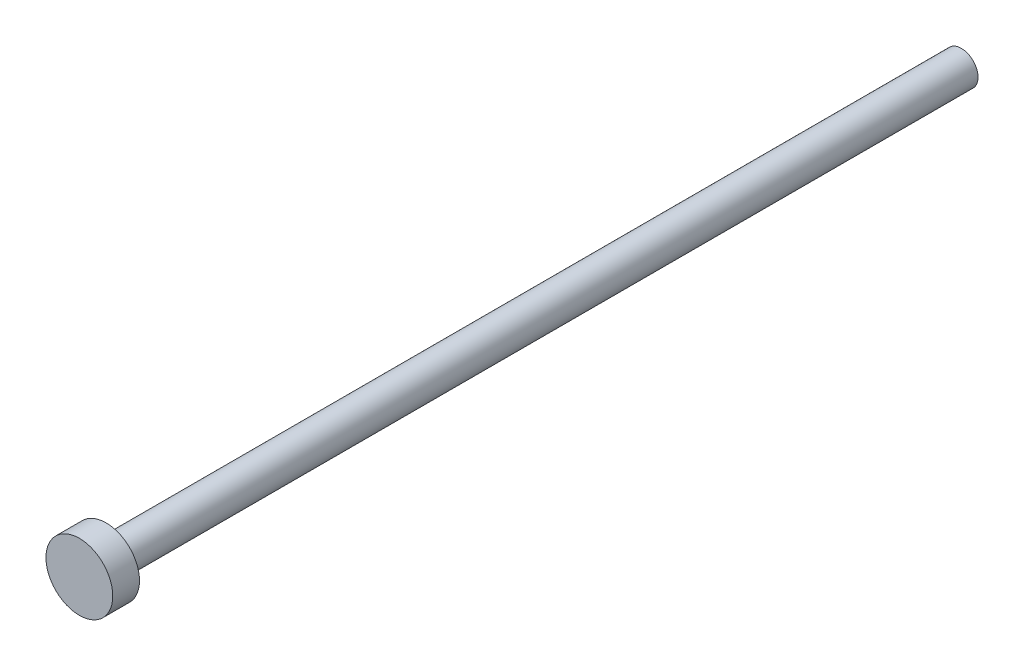
ISO-10303-21;
HEADER;
FILE_DESCRIPTION(('STEP AP214'),'2;1');
FILE_NAME('part.step','',(''),(''),'','','');
FILE_SCHEMA(('AUTOMOTIVE_DESIGN { 1 0 10303 214 1 1 1 1 }'));
ENDSEC;
DATA;
#1=APPLICATION_CONTEXT('core data for automotive mechanical design processes');
#2=APPLICATION_PROTOCOL_DEFINITION('international standard','automotive_design',2000,#1);
#3=PRODUCT_CONTEXT('',#1,'mechanical');
#4=PRODUCT('Part','Part','',(#3));
#5=PRODUCT_RELATED_PRODUCT_CATEGORY('part','',(#4));
#6=PRODUCT_DEFINITION_FORMATION('','',#4);
#7=PRODUCT_DEFINITION_CONTEXT('part definition',#1,'design');
#8=PRODUCT_DEFINITION('design','',#6,#7);
#9=PRODUCT_DEFINITION_SHAPE('','',#8);
#10=(LENGTH_UNIT() NAMED_UNIT(*) SI_UNIT(.MILLI.,.METRE.));
#11=(NAMED_UNIT(*) PLANE_ANGLE_UNIT() SI_UNIT($,.RADIAN.));
#12=(NAMED_UNIT(*) SI_UNIT($,.STERADIAN.) SOLID_ANGLE_UNIT());
#13=UNCERTAINTY_MEASURE_WITH_UNIT(LENGTH_MEASURE(1.E-05),#10,'distance_accuracy_value','');
#14=(GEOMETRIC_REPRESENTATION_CONTEXT(3) GLOBAL_UNCERTAINTY_ASSIGNED_CONTEXT((#13)) GLOBAL_UNIT_ASSIGNED_CONTEXT((#10,
#11,#12)) REPRESENTATION_CONTEXT('',''));
#15=CARTESIAN_POINT('',(0.,0.,0.));
#16=DIRECTION('',(0.,0.,1.));
#17=DIRECTION('',(1.,0.,0.));
#18=AXIS2_PLACEMENT_3D('',#15,#16,#17);
#19=CARTESIAN_POINT('',(0.,0.,1.));
#20=DIRECTION('',(0.,0.,-1.));
#21=DIRECTION('',(-1.,0.,0.));
#22=AXIS2_PLACEMENT_3D('',#19,#20,#21);
#23=CYLINDRICAL_SURFACE('',#22,1.25);
#24=CARTESIAN_POINT('',(0.,0.,1.));
#25=DIRECTION('',(0.,0.,1.));
#26=DIRECTION('',(1.,0.,0.));
#27=AXIS2_PLACEMENT_3D('',#24,#25,#26);
#28=CIRCLE('',#27,1.25);
#29=CARTESIAN_POINT('',(1.25,0.,1.));
#30=VERTEX_POINT('',#29);
#31=EDGE_CURVE('E44',#30,#30,#28,.T.);
#32=ORIENTED_EDGE('',*,*,#31,.F.);
#33=EDGE_LOOP('',(#32));
#34=FACE_BOUND('',#33,.T.);
#35=CARTESIAN_POINT('',(0.,0.,0.));
#36=DIRECTION('',(0.,0.,1.));
#37=DIRECTION('',(1.,0.,0.));
#38=AXIS2_PLACEMENT_3D('',#35,#36,#37);
#39=CIRCLE('',#38,1.25);
#40=CARTESIAN_POINT('',(1.25,0.,0.));
#41=VERTEX_POINT('',#40);
#42=EDGE_CURVE('E39',#41,#41,#39,.T.);
#43=ORIENTED_EDGE('',*,*,#42,.T.);
#44=EDGE_LOOP('',(#43));
#45=FACE_BOUND('',#44,.T.);
#46=ADVANCED_FACE('F36',(#34,#45),#23,.T.);
#47=CARTESIAN_POINT('',(0.,0.,1.));
#48=DIRECTION('',(0.,0.,1.));
#49=DIRECTION('',(1.,0.,0.));
#50=AXIS2_PLACEMENT_3D('',#47,#48,#49);
#51=PLANE('',#50);
#52=ORIENTED_EDGE('',*,*,#31,.T.);
#53=EDGE_LOOP('',(#52));
#54=FACE_BOUND('',#53,.T.);
#55=ADVANCED_FACE('F64',(#54),#51,.T.);
#56=CARTESIAN_POINT('',(0.,0.,0.));
#57=DIRECTION('',(0.,0.,1.));
#58=DIRECTION('',(1.,0.,0.));
#59=AXIS2_PLACEMENT_3D('',#56,#57,#58);
#60=PLANE('',#59);
#61=CARTESIAN_POINT('',(0.,0.,0.));
#62=DIRECTION('',(0.,0.,-1.));
#63=DIRECTION('',(-1.,0.,0.));
#64=AXIS2_PLACEMENT_3D('',#61,#62,#63);
#65=CIRCLE('',#64,0.625);
#66=CARTESIAN_POINT('',(-0.625,0.,0.));
#67=VERTEX_POINT('',#66);
#68=EDGE_CURVE('E10',#67,#67,#65,.T.);
#69=ORIENTED_EDGE('',*,*,#68,.F.);
#70=EDGE_LOOP('',(#69));
#71=FACE_BOUND('',#70,.T.);
#72=ORIENTED_EDGE('',*,*,#42,.F.);
#73=EDGE_LOOP('',(#72));
#74=FACE_BOUND('',#73,.T.);
#75=ADVANCED_FACE('F61',(#71,#74),#60,.F.);
#76=CARTESIAN_POINT('',(0.,0.,-32.));
#77=DIRECTION('',(0.,0.,1.));
#78=DIRECTION('',(1.,0.,0.));
#79=AXIS2_PLACEMENT_3D('',#76,#77,#78);
#80=CYLINDRICAL_SURFACE('',#79,0.625);
#81=CARTESIAN_POINT('',(0.,0.,-32.));
#82=DIRECTION('',(0.,0.,-1.));
#83=DIRECTION('',(-1.,0.,0.));
#84=AXIS2_PLACEMENT_3D('',#81,#82,#83);
#85=CIRCLE('',#84,0.625);
#86=CARTESIAN_POINT('',(-0.625,0.,-32.));
#87=VERTEX_POINT('',#86);
#88=EDGE_CURVE('E51',#87,#87,#85,.T.);
#89=ORIENTED_EDGE('',*,*,#88,.F.);
#90=EDGE_LOOP('',(#89));
#91=FACE_BOUND('',#90,.T.);
#92=ORIENTED_EDGE('',*,*,#68,.T.);
#93=EDGE_LOOP('',(#92));
#94=FACE_BOUND('',#93,.T.);
#95=ADVANCED_FACE('F63',(#91,#94),#80,.T.);
#96=CARTESIAN_POINT('',(0.,0.,-32.));
#97=DIRECTION('',(0.,0.,-1.));
#98=DIRECTION('',(-1.,0.,0.));
#99=AXIS2_PLACEMENT_3D('',#96,#97,#98);
#100=PLANE('',#99);
#101=ORIENTED_EDGE('',*,*,#88,.T.);
#102=EDGE_LOOP('',(#101));
#103=FACE_BOUND('',#102,.T.);
#104=ADVANCED_FACE('F70',(#103),#100,.T.);
#105=CLOSED_SHELL('',(#46,#55,#75,#95,#104));
#106=MANIFOLD_SOLID_BREP('B2',#105);
#107=ADVANCED_BREP_SHAPE_REPRESENTATION('',(#18,#106),#14);
#108=SHAPE_DEFINITION_REPRESENTATION(#9,#107);
ENDSEC;
END-ISO-10303-21;
